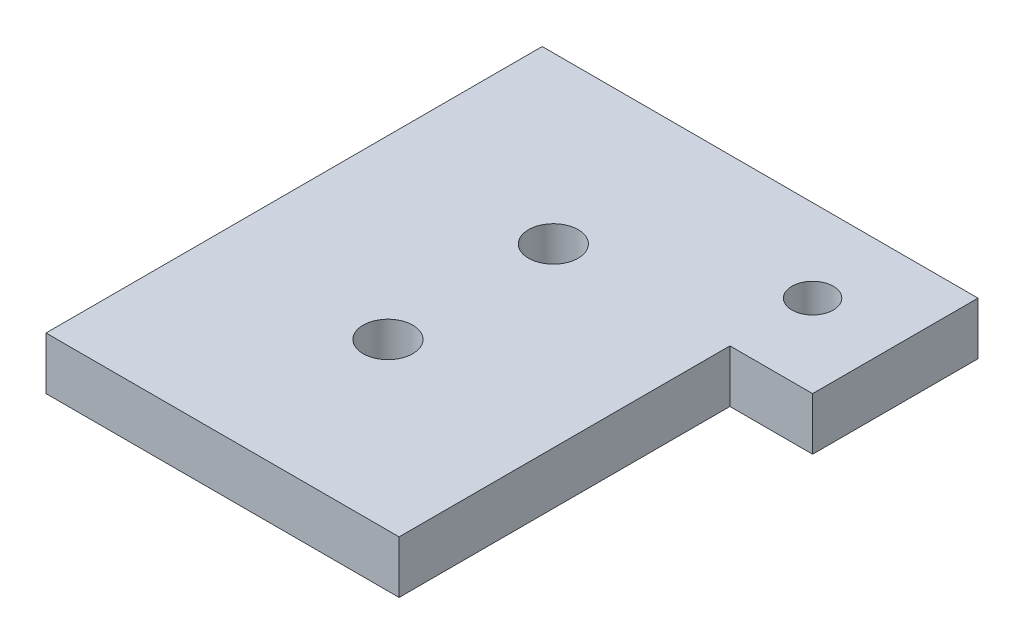
ISO-10303-21;
HEADER;
FILE_DESCRIPTION(('STEP AP214'),'2;1');
FILE_NAME('part.step','',(''),(''),'','','');
FILE_SCHEMA(('AUTOMOTIVE_DESIGN { 1 0 10303 214 1 1 1 1 }'));
ENDSEC;
DATA;
#1=APPLICATION_CONTEXT('core data for automotive mechanical design processes');
#2=APPLICATION_PROTOCOL_DEFINITION('international standard','automotive_design',2000,#1);
#3=PRODUCT_CONTEXT('',#1,'mechanical');
#4=PRODUCT('Part','Part','',(#3));
#5=PRODUCT_RELATED_PRODUCT_CATEGORY('part','',(#4));
#6=PRODUCT_DEFINITION_FORMATION('','',#4);
#7=PRODUCT_DEFINITION_CONTEXT('part definition',#1,'design');
#8=PRODUCT_DEFINITION('design','',#6,#7);
#9=PRODUCT_DEFINITION_SHAPE('','',#8);
#10=(LENGTH_UNIT() NAMED_UNIT(*) SI_UNIT(.MILLI.,.METRE.));
#11=(NAMED_UNIT(*) PLANE_ANGLE_UNIT() SI_UNIT($,.RADIAN.));
#12=(NAMED_UNIT(*) SI_UNIT($,.STERADIAN.) SOLID_ANGLE_UNIT());
#13=UNCERTAINTY_MEASURE_WITH_UNIT(LENGTH_MEASURE(1.E-05),#10,'distance_accuracy_value','');
#14=(GEOMETRIC_REPRESENTATION_CONTEXT(3) GLOBAL_UNCERTAINTY_ASSIGNED_CONTEXT((#13)) GLOBAL_UNIT_ASSIGNED_CONTEXT((#10,
#11,#12)) REPRESENTATION_CONTEXT('',''));
#15=CARTESIAN_POINT('',(0.,0.,0.));
#16=DIRECTION('',(0.,0.,1.));
#17=DIRECTION('',(1.,0.,0.));
#18=AXIS2_PLACEMENT_3D('',#15,#16,#17);
#19=CARTESIAN_POINT('',(26.3500000000002,3.175,-1.46271883494365E-13));
#20=DIRECTION('',(1.,0.,0.));
#21=DIRECTION('',(0.,0.,-1.));
#22=AXIS2_PLACEMENT_3D('',#19,#20,#21);
#23=PLANE('',#22);
#24=DIRECTION('',(0.,0.,1.));
#25=VECTOR('',#24,1.);
#26=CARTESIAN_POINT('',(26.3500000000002,0.,-1.46271883494365E-13));
#27=LINE('',#26,#25);
#28=CARTESIAN_POINT('',(26.35,0.,-30.));
#29=VERTEX_POINT('',#28);
#30=CARTESIAN_POINT('',(26.35,0.,-20.));
#31=VERTEX_POINT('',#30);
#32=EDGE_CURVE('E124',#29,#31,#27,.T.);
#33=ORIENTED_EDGE('',*,*,#32,.F.);
#34=DIRECTION('',(0.,-1.,0.));
#35=VECTOR('',#34,1.);
#36=CARTESIAN_POINT('',(26.35,3.175,-30.));
#37=LINE('',#36,#35);
#38=CARTESIAN_POINT('',(26.35,3.175,-30.));
#39=VERTEX_POINT('',#38);
#40=EDGE_CURVE('E11',#39,#29,#37,.T.);
#41=ORIENTED_EDGE('',*,*,#40,.F.);
#42=DIRECTION('',(0.,0.,1.));
#43=VECTOR('',#42,1.);
#44=CARTESIAN_POINT('',(26.3500000000002,3.175,-1.46271883494365E-13));
#45=LINE('',#44,#43);
#46=CARTESIAN_POINT('',(26.35,3.175,-20.));
#47=VERTEX_POINT('',#46);
#48=EDGE_CURVE('E146',#39,#47,#45,.T.);
#49=ORIENTED_EDGE('',*,*,#48,.T.);
#50=DIRECTION('',(0.,-1.,0.));
#51=VECTOR('',#50,1.);
#52=CARTESIAN_POINT('',(26.35,3.175,-20.));
#53=LINE('',#52,#51);
#54=EDGE_CURVE('E79',#47,#31,#53,.T.);
#55=ORIENTED_EDGE('',*,*,#54,.T.);
#56=EDGE_LOOP('',(#33,#41,#49,#55));
#57=FACE_BOUND('',#56,.T.);
#58=ADVANCED_FACE('F34',(#57),#23,.T.);
#59=CARTESIAN_POINT('',(0.,3.175,-30.));
#60=DIRECTION('',(0.,0.,-1.));
#61=DIRECTION('',(-1.,0.,0.));
#62=AXIS2_PLACEMENT_3D('',#59,#60,#61);
#63=PLANE('',#62);
#64=DIRECTION('',(1.,0.,0.));
#65=VECTOR('',#64,1.);
#66=CARTESIAN_POINT('',(0.,0.,-30.));
#67=LINE('',#66,#65);
#68=CARTESIAN_POINT('',(0.,0.,-30.));
#69=VERTEX_POINT('',#68);
#70=EDGE_CURVE('E127',#69,#29,#67,.T.);
#71=ORIENTED_EDGE('',*,*,#70,.F.);
#72=DIRECTION('',(0.,-1.,0.));
#73=VECTOR('',#72,1.);
#74=CARTESIAN_POINT('',(0.,3.175,-30.));
#75=LINE('',#74,#73);
#76=CARTESIAN_POINT('',(0.,3.175,-30.));
#77=VERTEX_POINT('',#76);
#78=EDGE_CURVE('E42',#77,#69,#75,.T.);
#79=ORIENTED_EDGE('',*,*,#78,.F.);
#80=DIRECTION('',(1.,0.,0.));
#81=VECTOR('',#80,1.);
#82=CARTESIAN_POINT('',(0.,3.175,-30.));
#83=LINE('',#82,#81);
#84=EDGE_CURVE('E162',#77,#39,#83,.T.);
#85=ORIENTED_EDGE('',*,*,#84,.T.);
#86=ORIENTED_EDGE('',*,*,#40,.T.);
#87=EDGE_LOOP('',(#71,#79,#85,#86));
#88=FACE_BOUND('',#87,.T.);
#89=ADVANCED_FACE('F155',(#88),#63,.T.);
#90=CARTESIAN_POINT('',(0.,3.175,0.));
#91=DIRECTION('',(-1.,0.,0.));
#92=DIRECTION('',(0.,0.,1.));
#93=AXIS2_PLACEMENT_3D('',#90,#91,#92);
#94=PLANE('',#93);
#95=DIRECTION('',(0.,0.,-1.));
#96=VECTOR('',#95,1.);
#97=CARTESIAN_POINT('',(0.,0.,0.));
#98=LINE('',#97,#96);
#99=CARTESIAN_POINT('',(0.,0.,0.));
#100=VERTEX_POINT('',#99);
#101=EDGE_CURVE('E130',#100,#69,#98,.T.);
#102=ORIENTED_EDGE('',*,*,#101,.F.);
#103=DIRECTION('',(0.,-1.,0.));
#104=VECTOR('',#103,1.);
#105=CARTESIAN_POINT('',(0.,3.175,0.));
#106=LINE('',#105,#104);
#107=CARTESIAN_POINT('',(0.,3.175,0.));
#108=VERTEX_POINT('',#107);
#109=EDGE_CURVE('E107',#108,#100,#106,.T.);
#110=ORIENTED_EDGE('',*,*,#109,.F.);
#111=DIRECTION('',(0.,0.,-1.));
#112=VECTOR('',#111,1.);
#113=CARTESIAN_POINT('',(0.,3.175,0.));
#114=LINE('',#113,#112);
#115=EDGE_CURVE('E100',#108,#77,#114,.T.);
#116=ORIENTED_EDGE('',*,*,#115,.T.);
#117=ORIENTED_EDGE('',*,*,#78,.T.);
#118=EDGE_LOOP('',(#102,#110,#116,#117));
#119=FACE_BOUND('',#118,.T.);
#120=ADVANCED_FACE('F152',(#119),#94,.T.);
#121=CARTESIAN_POINT('',(0.,3.175,0.));
#122=DIRECTION('',(0.,0.,-1.));
#123=DIRECTION('',(-1.,0.,0.));
#124=AXIS2_PLACEMENT_3D('',#121,#122,#123);
#125=PLANE('',#124);
#126=DIRECTION('',(1.,0.,0.));
#127=VECTOR('',#126,1.);
#128=CARTESIAN_POINT('',(0.,0.,0.));
#129=LINE('',#128,#127);
#130=CARTESIAN_POINT('',(21.35,0.,0.));
#131=VERTEX_POINT('',#130);
#132=EDGE_CURVE('E106',#100,#131,#129,.T.);
#133=ORIENTED_EDGE('',*,*,#132,.T.);
#134=DIRECTION('',(0.,-1.,0.));
#135=VECTOR('',#134,1.);
#136=CARTESIAN_POINT('',(21.35,3.175,0.));
#137=LINE('',#136,#135);
#138=CARTESIAN_POINT('',(21.35,3.175,0.));
#139=VERTEX_POINT('',#138);
#140=EDGE_CURVE('E103',#139,#131,#137,.T.);
#141=ORIENTED_EDGE('',*,*,#140,.F.);
#142=DIRECTION('',(1.,0.,0.));
#143=VECTOR('',#142,1.);
#144=CARTESIAN_POINT('',(0.,3.175,0.));
#145=LINE('',#144,#143);
#146=EDGE_CURVE('E92',#108,#139,#145,.T.);
#147=ORIENTED_EDGE('',*,*,#146,.F.);
#148=ORIENTED_EDGE('',*,*,#109,.T.);
#149=EDGE_LOOP('',(#133,#141,#147,#148));
#150=FACE_BOUND('',#149,.T.);
#151=ADVANCED_FACE('F104',(#150),#125,.F.);
#152=CARTESIAN_POINT('',(21.35,3.175,0.));
#153=DIRECTION('',(-1.,0.,0.));
#154=DIRECTION('',(0.,0.,1.));
#155=AXIS2_PLACEMENT_3D('',#152,#153,#154);
#156=PLANE('',#155);
#157=DIRECTION('',(0.,0.,-1.));
#158=VECTOR('',#157,1.);
#159=CARTESIAN_POINT('',(21.35,0.,0.));
#160=LINE('',#159,#158);
#161=CARTESIAN_POINT('',(21.35,0.,-20.));
#162=VERTEX_POINT('',#161);
#163=EDGE_CURVE('E72',#131,#162,#160,.T.);
#164=ORIENTED_EDGE('',*,*,#163,.T.);
#165=DIRECTION('',(0.,-1.,0.));
#166=VECTOR('',#165,1.);
#167=CARTESIAN_POINT('',(21.35,3.175,-20.));
#168=LINE('',#167,#166);
#169=CARTESIAN_POINT('',(21.35,3.175,-20.));
#170=VERTEX_POINT('',#169);
#171=EDGE_CURVE('E108',#170,#162,#168,.T.);
#172=ORIENTED_EDGE('',*,*,#171,.F.);
#173=DIRECTION('',(0.,0.,-1.));
#174=VECTOR('',#173,1.);
#175=CARTESIAN_POINT('',(21.35,3.175,0.));
#176=LINE('',#175,#174);
#177=EDGE_CURVE('E97',#139,#170,#176,.T.);
#178=ORIENTED_EDGE('',*,*,#177,.F.);
#179=ORIENTED_EDGE('',*,*,#140,.T.);
#180=EDGE_LOOP('',(#164,#172,#178,#179));
#181=FACE_BOUND('',#180,.T.);
#182=ADVANCED_FACE('F110',(#181),#156,.F.);
#183=CARTESIAN_POINT('',(10.675,3.175,-20.));
#184=DIRECTION('',(0.,-1.,0.));
#185=DIRECTION('',(0.,0.,-1.));
#186=AXIS2_PLACEMENT_3D('',#183,#184,#185);
#187=CYLINDRICAL_SURFACE('',#186,1.5);
#188=CARTESIAN_POINT('',(10.675,3.175,-20.));
#189=DIRECTION('',(0.,1.,0.));
#190=DIRECTION('',(0.,0.,1.));
#191=AXIS2_PLACEMENT_3D('',#188,#189,#190);
#192=CIRCLE('',#191,1.5);
#193=CARTESIAN_POINT('',(10.675,3.175,-18.5));
#194=VERTEX_POINT('',#193);
#195=EDGE_CURVE('E118',#194,#194,#192,.T.);
#196=ORIENTED_EDGE('',*,*,#195,.T.);
#197=EDGE_LOOP('',(#196));
#198=FACE_BOUND('',#197,.T.);
#199=CARTESIAN_POINT('',(10.675,0.,-20.));
#200=DIRECTION('',(0.,1.,0.));
#201=DIRECTION('',(0.,0.,1.));
#202=AXIS2_PLACEMENT_3D('',#199,#200,#201);
#203=CIRCLE('',#202,1.5);
#204=CARTESIAN_POINT('',(10.675,0.,-18.5));
#205=VERTEX_POINT('',#204);
#206=EDGE_CURVE('E140',#205,#205,#203,.T.);
#207=ORIENTED_EDGE('',*,*,#206,.F.);
#208=EDGE_LOOP('',(#207));
#209=FACE_BOUND('',#208,.T.);
#210=ADVANCED_FACE('F178',(#198,#209),#187,.F.);
#211=CARTESIAN_POINT('',(10.675,3.175,-10.));
#212=DIRECTION('',(0.,-1.,0.));
#213=DIRECTION('',(0.,0.,-1.));
#214=AXIS2_PLACEMENT_3D('',#211,#212,#213);
#215=CYLINDRICAL_SURFACE('',#214,1.5);
#216=CARTESIAN_POINT('',(10.675,3.175,-10.));
#217=DIRECTION('',(0.,1.,0.));
#218=DIRECTION('',(0.,0.,1.));
#219=AXIS2_PLACEMENT_3D('',#216,#217,#218);
#220=CIRCLE('',#219,1.5);
#221=CARTESIAN_POINT('',(10.675,3.175,-8.5));
#222=VERTEX_POINT('',#221);
#223=EDGE_CURVE('E112',#222,#222,#220,.T.);
#224=ORIENTED_EDGE('',*,*,#223,.T.);
#225=EDGE_LOOP('',(#224));
#226=FACE_BOUND('',#225,.T.);
#227=CARTESIAN_POINT('',(10.675,0.,-10.));
#228=DIRECTION('',(0.,1.,0.));
#229=DIRECTION('',(0.,0.,1.));
#230=AXIS2_PLACEMENT_3D('',#227,#228,#229);
#231=CIRCLE('',#230,1.5);
#232=CARTESIAN_POINT('',(10.675,0.,-8.5));
#233=VERTEX_POINT('',#232);
#234=EDGE_CURVE('E137',#233,#233,#231,.T.);
#235=ORIENTED_EDGE('',*,*,#234,.F.);
#236=EDGE_LOOP('',(#235));
#237=FACE_BOUND('',#236,.T.);
#238=ADVANCED_FACE('F182',(#226,#237),#215,.F.);
#239=CARTESIAN_POINT('',(0.,3.175,-20.));
#240=DIRECTION('',(0.,0.,-1.));
#241=DIRECTION('',(-1.,0.,0.));
#242=AXIS2_PLACEMENT_3D('',#239,#240,#241);
#243=PLANE('',#242);
#244=DIRECTION('',(1.,0.,0.));
#245=VECTOR('',#244,1.);
#246=CARTESIAN_POINT('',(0.,0.,-20.));
#247=LINE('',#246,#245);
#248=EDGE_CURVE('E135',#162,#31,#247,.T.);
#249=ORIENTED_EDGE('',*,*,#248,.T.);
#250=ORIENTED_EDGE('',*,*,#54,.F.);
#251=DIRECTION('',(1.,0.,0.));
#252=VECTOR('',#251,1.);
#253=CARTESIAN_POINT('',(0.,3.175,-20.));
#254=LINE('',#253,#252);
#255=EDGE_CURVE('E50',#170,#47,#254,.T.);
#256=ORIENTED_EDGE('',*,*,#255,.F.);
#257=ORIENTED_EDGE('',*,*,#171,.T.);
#258=EDGE_LOOP('',(#249,#250,#256,#257));
#259=FACE_BOUND('',#258,.T.);
#260=ADVANCED_FACE('F161',(#259),#243,.F.);
#261=CARTESIAN_POINT('',(21.35,3.175,-25.));
#262=DIRECTION('',(0.,-1.,0.));
#263=DIRECTION('',(0.,0.,-1.));
#264=AXIS2_PLACEMENT_3D('',#261,#262,#263);
#265=CYLINDRICAL_SURFACE('',#264,1.25000000000002);
#266=CARTESIAN_POINT('',(21.35,3.175,-25.));
#267=DIRECTION('',(0.,1.,0.));
#268=DIRECTION('',(0.,0.,1.));
#269=AXIS2_PLACEMENT_3D('',#266,#267,#268);
#270=CIRCLE('',#269,1.25000000000002);
#271=CARTESIAN_POINT('',(21.35,3.175,-23.75));
#272=VERTEX_POINT('',#271);
#273=EDGE_CURVE('E121',#272,#272,#270,.T.);
#274=ORIENTED_EDGE('',*,*,#273,.T.);
#275=EDGE_LOOP('',(#274));
#276=FACE_BOUND('',#275,.T.);
#277=CARTESIAN_POINT('',(21.35,0.,-25.));
#278=DIRECTION('',(0.,1.,0.));
#279=DIRECTION('',(0.,0.,1.));
#280=AXIS2_PLACEMENT_3D('',#277,#278,#279);
#281=CIRCLE('',#280,1.25000000000002);
#282=CARTESIAN_POINT('',(21.35,0.,-23.75));
#283=VERTEX_POINT('',#282);
#284=EDGE_CURVE('E143',#283,#283,#281,.T.);
#285=ORIENTED_EDGE('',*,*,#284,.F.);
#286=EDGE_LOOP('',(#285));
#287=FACE_BOUND('',#286,.T.);
#288=ADVANCED_FACE('F181',(#276,#287),#265,.F.);
#289=CARTESIAN_POINT('',(0.,3.175,0.));
#290=DIRECTION('',(0.,1.,0.));
#291=DIRECTION('',(0.,0.,1.));
#292=AXIS2_PLACEMENT_3D('',#289,#290,#291);
#293=PLANE('',#292);
#294=ORIENTED_EDGE('',*,*,#48,.F.);
#295=ORIENTED_EDGE('',*,*,#84,.F.);
#296=ORIENTED_EDGE('',*,*,#115,.F.);
#297=ORIENTED_EDGE('',*,*,#146,.T.);
#298=ORIENTED_EDGE('',*,*,#177,.T.);
#299=ORIENTED_EDGE('',*,*,#255,.T.);
#300=EDGE_LOOP('',(#294,#295,#296,#297,#298,#299));
#301=FACE_BOUND('',#300,.T.);
#302=ORIENTED_EDGE('',*,*,#223,.F.);
#303=EDGE_LOOP('',(#302));
#304=FACE_BOUND('',#303,.T.);
#305=ORIENTED_EDGE('',*,*,#195,.F.);
#306=EDGE_LOOP('',(#305));
#307=FACE_BOUND('',#306,.T.);
#308=ORIENTED_EDGE('',*,*,#273,.F.);
#309=EDGE_LOOP('',(#308));
#310=FACE_BOUND('',#309,.T.);
#311=ADVANCED_FACE('F94',(#301,#304,#307,#310),#293,.T.);
#312=CARTESIAN_POINT('',(0.,0.,0.));
#313=DIRECTION('',(0.,1.,0.));
#314=DIRECTION('',(0.,0.,1.));
#315=AXIS2_PLACEMENT_3D('',#312,#313,#314);
#316=PLANE('',#315);
#317=ORIENTED_EDGE('',*,*,#32,.T.);
#318=ORIENTED_EDGE('',*,*,#248,.F.);
#319=ORIENTED_EDGE('',*,*,#163,.F.);
#320=ORIENTED_EDGE('',*,*,#132,.F.);
#321=ORIENTED_EDGE('',*,*,#101,.T.);
#322=ORIENTED_EDGE('',*,*,#70,.T.);
#323=EDGE_LOOP('',(#317,#318,#319,#320,#321,#322));
#324=FACE_BOUND('',#323,.T.);
#325=ORIENTED_EDGE('',*,*,#234,.T.);
#326=EDGE_LOOP('',(#325));
#327=FACE_BOUND('',#326,.T.);
#328=ORIENTED_EDGE('',*,*,#206,.T.);
#329=EDGE_LOOP('',(#328));
#330=FACE_BOUND('',#329,.T.);
#331=ORIENTED_EDGE('',*,*,#284,.T.);
#332=EDGE_LOOP('',(#331));
#333=FACE_BOUND('',#332,.T.);
#334=ADVANCED_FACE('F157',(#324,#327,#330,#333),#316,.F.);
#335=CLOSED_SHELL('',(#58,#89,#120,#151,#182,#210,#238,#260,#288,#311,#334));
#336=MANIFOLD_SOLID_BREP('B2',#335);
#337=ADVANCED_BREP_SHAPE_REPRESENTATION('',(#18,#336),#14);
#338=SHAPE_DEFINITION_REPRESENTATION(#9,#337);
ENDSEC;
END-ISO-10303-21;
